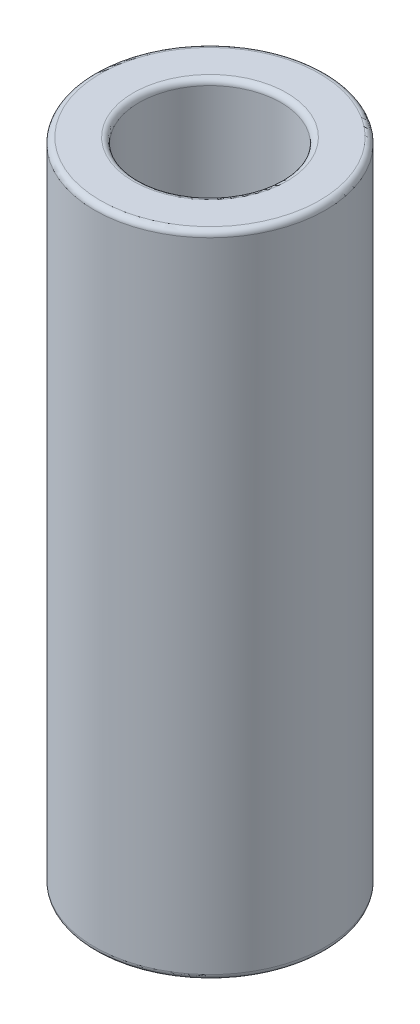
ISO-10303-21;
HEADER;
FILE_DESCRIPTION(('STEP AP214'),'2;1');
FILE_NAME('part.step','',(''),(''),'','','');
FILE_SCHEMA(('AUTOMOTIVE_DESIGN { 1 0 10303 214 1 1 1 1 }'));
ENDSEC;
DATA;
#1=APPLICATION_CONTEXT('core data for automotive mechanical design processes');
#2=APPLICATION_PROTOCOL_DEFINITION('international standard','automotive_design',2000,#1);
#3=PRODUCT_CONTEXT('',#1,'mechanical');
#4=PRODUCT('Part','Part','',(#3));
#5=PRODUCT_RELATED_PRODUCT_CATEGORY('part','',(#4));
#6=PRODUCT_DEFINITION_FORMATION('','',#4);
#7=PRODUCT_DEFINITION_CONTEXT('part definition',#1,'design');
#8=PRODUCT_DEFINITION('design','',#6,#7);
#9=PRODUCT_DEFINITION_SHAPE('','',#8);
#10=(LENGTH_UNIT() NAMED_UNIT(*) SI_UNIT(.MILLI.,.METRE.));
#11=(NAMED_UNIT(*) PLANE_ANGLE_UNIT() SI_UNIT($,.RADIAN.));
#12=(NAMED_UNIT(*) SI_UNIT($,.STERADIAN.) SOLID_ANGLE_UNIT());
#13=UNCERTAINTY_MEASURE_WITH_UNIT(LENGTH_MEASURE(1.E-05),#10,'distance_accuracy_value','');
#14=(GEOMETRIC_REPRESENTATION_CONTEXT(3) GLOBAL_UNCERTAINTY_ASSIGNED_CONTEXT((#13)) GLOBAL_UNIT_ASSIGNED_CONTEXT((#10,
#11,#12)) REPRESENTATION_CONTEXT('',''));
#15=CARTESIAN_POINT('',(0.,0.,0.));
#16=DIRECTION('',(0.,0.,1.));
#17=DIRECTION('',(1.,0.,0.));
#18=AXIS2_PLACEMENT_3D('',#15,#16,#17);
#19=CARTESIAN_POINT('',(0.,-7.96195652173913,0.));
#20=DIRECTION('',(0.,-1.,0.));
#21=DIRECTION('',(0.,0.,-1.));
#22=AXIS2_PLACEMENT_3D('',#19,#20,#21);
#23=CYLINDRICAL_SURFACE('',#22,2.5);
#24=CARTESIAN_POINT('',(0.,-11.23,0.));
#25=DIRECTION('',(0.,-1.,0.));
#26=DIRECTION('',(0.,0.,-1.));
#27=AXIS2_PLACEMENT_3D('',#24,#25,#26);
#28=CIRCLE('',#27,2.5);
#29=CARTESIAN_POINT('',(0.,-11.23,-2.5));
#30=VERTEX_POINT('',#29);
#31=EDGE_CURVE('E75',#30,#30,#28,.T.);
#32=ORIENTED_EDGE('',*,*,#31,.T.);
#33=EDGE_LOOP('',(#32));
#34=FACE_BOUND('',#33,.T.);
#35=CARTESIAN_POINT('',(0.,11.23,0.));
#36=DIRECTION('',(0.,1.,0.));
#37=DIRECTION('',(0.,0.,1.));
#38=AXIS2_PLACEMENT_3D('',#35,#36,#37);
#39=CIRCLE('',#38,2.5);
#40=CARTESIAN_POINT('',(0.,11.23,2.5));
#41=VERTEX_POINT('',#40);
#42=EDGE_CURVE('E79',#41,#41,#39,.T.);
#43=ORIENTED_EDGE('',*,*,#42,.T.);
#44=EDGE_LOOP('',(#43));
#45=FACE_BOUND('',#44,.T.);
#46=ADVANCED_FACE('F43',(#34,#45),#23,.F.);
#47=CARTESIAN_POINT('',(2.5,-11.43,0.));
#48=DIRECTION('',(0.,-1.,0.));
#49=DIRECTION('',(0.,0.,-1.));
#50=AXIS2_PLACEMENT_3D('',#47,#48,#49);
#51=PLANE('',#50);
#52=CARTESIAN_POINT('',(0.,-11.43,0.));
#53=DIRECTION('',(0.,-1.,0.));
#54=DIRECTION('',(0.,0.,-1.));
#55=AXIS2_PLACEMENT_3D('',#52,#53,#54);
#56=CIRCLE('',#55,2.7);
#57=CARTESIAN_POINT('',(0.,-11.43,-2.7));
#58=VERTEX_POINT('',#57);
#59=EDGE_CURVE('E67',#58,#58,#56,.F.);
#60=ORIENTED_EDGE('',*,*,#59,.T.);
#61=EDGE_LOOP('',(#60));
#62=FACE_BOUND('',#61,.T.);
#63=CARTESIAN_POINT('',(0.,-11.43,0.));
#64=DIRECTION('',(0.,-1.,0.));
#65=DIRECTION('',(0.,0.,-1.));
#66=AXIS2_PLACEMENT_3D('',#63,#64,#65);
#67=CIRCLE('',#66,3.8625);
#68=CARTESIAN_POINT('',(0.,-11.43,-3.8625));
#69=VERTEX_POINT('',#68);
#70=EDGE_CURVE('E71',#69,#69,#67,.T.);
#71=ORIENTED_EDGE('',*,*,#70,.T.);
#72=EDGE_LOOP('',(#71));
#73=FACE_BOUND('',#72,.T.);
#74=ADVANCED_FACE('F94',(#62,#73),#51,.T.);
#75=CARTESIAN_POINT('',(0.,-7.96195652173913,0.));
#76=DIRECTION('',(0.,-1.,0.));
#77=DIRECTION('',(0.,0.,-1.));
#78=AXIS2_PLACEMENT_3D('',#75,#76,#77);
#79=CYLINDRICAL_SURFACE('',#78,4.0625);
#80=CARTESIAN_POINT('',(0.,-11.23,0.));
#81=DIRECTION('',(0.,-1.,0.));
#82=DIRECTION('',(0.,0.,-1.));
#83=AXIS2_PLACEMENT_3D('',#80,#81,#82);
#84=CIRCLE('',#83,4.0625);
#85=CARTESIAN_POINT('',(0.,-11.23,-4.0625));
#86=VERTEX_POINT('',#85);
#87=EDGE_CURVE('E56',#86,#86,#84,.F.);
#88=ORIENTED_EDGE('',*,*,#87,.T.);
#89=EDGE_LOOP('',(#88));
#90=FACE_BOUND('',#89,.T.);
#91=CARTESIAN_POINT('',(0.,11.23,0.));
#92=DIRECTION('',(0.,1.,0.));
#93=DIRECTION('',(0.,0.,1.));
#94=AXIS2_PLACEMENT_3D('',#91,#92,#93);
#95=CIRCLE('',#94,4.0625);
#96=CARTESIAN_POINT('',(0.,11.23,4.0625));
#97=VERTEX_POINT('',#96);
#98=EDGE_CURVE('E61',#97,#97,#95,.F.);
#99=ORIENTED_EDGE('',*,*,#98,.T.);
#100=EDGE_LOOP('',(#99));
#101=FACE_BOUND('',#100,.T.);
#102=ADVANCED_FACE('F100',(#90,#101),#79,.T.);
#103=CARTESIAN_POINT('',(2.5,11.43,0.));
#104=DIRECTION('',(0.,1.,0.));
#105=DIRECTION('',(0.,0.,1.));
#106=AXIS2_PLACEMENT_3D('',#103,#104,#105);
#107=PLANE('',#106);
#108=CARTESIAN_POINT('',(0.,11.43,0.));
#109=DIRECTION('',(0.,1.,0.));
#110=DIRECTION('',(0.,0.,1.));
#111=AXIS2_PLACEMENT_3D('',#108,#109,#110);
#112=CIRCLE('',#111,3.8625);
#113=CARTESIAN_POINT('',(0.,11.43,3.8625));
#114=VERTEX_POINT('',#113);
#115=EDGE_CURVE('E10',#114,#114,#112,.T.);
#116=ORIENTED_EDGE('',*,*,#115,.T.);
#117=EDGE_LOOP('',(#116));
#118=FACE_BOUND('',#117,.T.);
#119=CARTESIAN_POINT('',(0.,11.43,0.));
#120=DIRECTION('',(0.,1.,0.));
#121=DIRECTION('',(0.,0.,1.));
#122=AXIS2_PLACEMENT_3D('',#119,#120,#121);
#123=CIRCLE('',#122,2.7);
#124=CARTESIAN_POINT('',(0.,11.43,2.7));
#125=VERTEX_POINT('',#124);
#126=EDGE_CURVE('E51',#125,#125,#123,.F.);
#127=ORIENTED_EDGE('',*,*,#126,.T.);
#128=EDGE_LOOP('',(#127));
#129=FACE_BOUND('',#128,.T.);
#130=ADVANCED_FACE('F108',(#118,#129),#107,.T.);
#131=CARTESIAN_POINT('',(0.,-11.23,0.));
#132=DIRECTION('',(0.,-1.,0.));
#133=DIRECTION('',(0.,0.,-1.));
#134=AXIS2_PLACEMENT_3D('',#131,#132,#133);
#135=TOROIDAL_SURFACE('',#134,2.7,0.2);
#136=ORIENTED_EDGE('',*,*,#59,.F.);
#137=EDGE_LOOP('',(#136));
#138=FACE_BOUND('',#137,.T.);
#139=ORIENTED_EDGE('',*,*,#31,.F.);
#140=EDGE_LOOP('',(#139));
#141=FACE_BOUND('',#140,.T.);
#142=ADVANCED_FACE('F105',(#138,#141),#135,.T.);
#143=CARTESIAN_POINT('',(0.,-11.23,0.));
#144=DIRECTION('',(0.,-1.,0.));
#145=DIRECTION('',(0.,0.,-1.));
#146=AXIS2_PLACEMENT_3D('',#143,#144,#145);
#147=TOROIDAL_SURFACE('',#146,3.8625,0.2);
#148=ORIENTED_EDGE('',*,*,#87,.F.);
#149=EDGE_LOOP('',(#148));
#150=FACE_BOUND('',#149,.T.);
#151=ORIENTED_EDGE('',*,*,#70,.F.);
#152=EDGE_LOOP('',(#151));
#153=FACE_BOUND('',#152,.T.);
#154=ADVANCED_FACE('F91',(#150,#153),#147,.T.);
#155=CARTESIAN_POINT('',(0.,11.23,0.));
#156=DIRECTION('',(0.,1.,0.));
#157=DIRECTION('',(0.,0.,1.));
#158=AXIS2_PLACEMENT_3D('',#155,#156,#157);
#159=TOROIDAL_SURFACE('',#158,3.8625,0.2);
#160=ORIENTED_EDGE('',*,*,#115,.F.);
#161=EDGE_LOOP('',(#160));
#162=FACE_BOUND('',#161,.T.);
#163=ORIENTED_EDGE('',*,*,#98,.F.);
#164=EDGE_LOOP('',(#163));
#165=FACE_BOUND('',#164,.T.);
#166=ADVANCED_FACE('F87',(#162,#165),#159,.T.);
#167=CARTESIAN_POINT('',(0.,11.23,0.));
#168=DIRECTION('',(0.,1.,0.));
#169=DIRECTION('',(0.,0.,1.));
#170=AXIS2_PLACEMENT_3D('',#167,#168,#169);
#171=TOROIDAL_SURFACE('',#170,2.7,0.2);
#172=ORIENTED_EDGE('',*,*,#42,.F.);
#173=EDGE_LOOP('',(#172));
#174=FACE_BOUND('',#173,.T.);
#175=ORIENTED_EDGE('',*,*,#126,.F.);
#176=EDGE_LOOP('',(#175));
#177=FACE_BOUND('',#176,.T.);
#178=ADVANCED_FACE('F45',(#174,#177),#171,.T.);
#179=CLOSED_SHELL('',(#46,#74,#102,#130,#142,#154,#166,#178));
#180=MANIFOLD_SOLID_BREP('B2',#179);
#181=ADVANCED_BREP_SHAPE_REPRESENTATION('',(#18,#180),#14);
#182=SHAPE_DEFINITION_REPRESENTATION(#9,#181);
ENDSEC;
END-ISO-10303-21;
